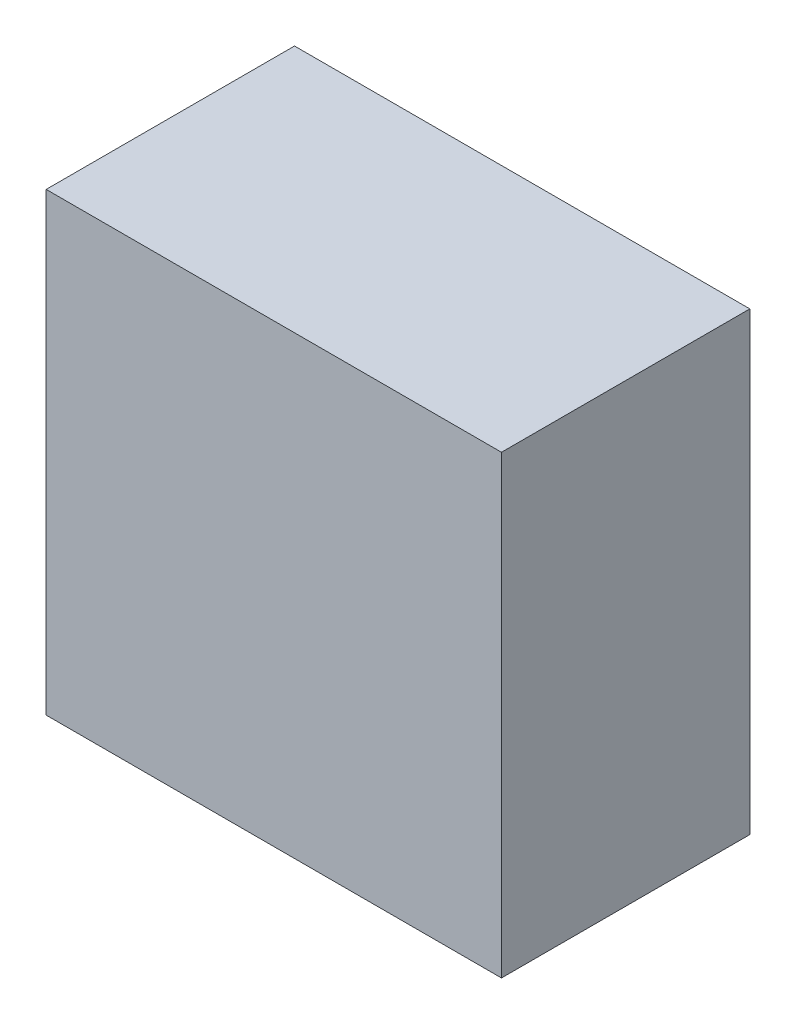
ISO-10303-21;
HEADER;
FILE_DESCRIPTION(('STEP AP214'),'2;1');
FILE_NAME('part.step','',(''),(''),'','','');
FILE_SCHEMA(('AUTOMOTIVE_DESIGN { 1 0 10303 214 1 1 1 1 }'));
ENDSEC;
DATA;
#1=APPLICATION_CONTEXT('core data for automotive mechanical design processes');
#2=APPLICATION_PROTOCOL_DEFINITION('international standard','automotive_design',2000,#1);
#3=PRODUCT_CONTEXT('',#1,'mechanical');
#4=PRODUCT('Part','Part','',(#3));
#5=PRODUCT_RELATED_PRODUCT_CATEGORY('part','',(#4));
#6=PRODUCT_DEFINITION_FORMATION('','',#4);
#7=PRODUCT_DEFINITION_CONTEXT('part definition',#1,'design');
#8=PRODUCT_DEFINITION('design','',#6,#7);
#9=PRODUCT_DEFINITION_SHAPE('','',#8);
#10=(LENGTH_UNIT() NAMED_UNIT(*) SI_UNIT(.MILLI.,.METRE.));
#11=(NAMED_UNIT(*) PLANE_ANGLE_UNIT() SI_UNIT($,.RADIAN.));
#12=(NAMED_UNIT(*) SI_UNIT($,.STERADIAN.) SOLID_ANGLE_UNIT());
#13=UNCERTAINTY_MEASURE_WITH_UNIT(LENGTH_MEASURE(1.E-05),#10,'distance_accuracy_value','');
#14=(GEOMETRIC_REPRESENTATION_CONTEXT(3) GLOBAL_UNCERTAINTY_ASSIGNED_CONTEXT((#13)) GLOBAL_UNIT_ASSIGNED_CONTEXT((#10,
#11,#12)) REPRESENTATION_CONTEXT('',''));
#15=CARTESIAN_POINT('',(0.,0.,0.));
#16=DIRECTION('',(0.,0.,1.));
#17=DIRECTION('',(1.,0.,0.));
#18=AXIS2_PLACEMENT_3D('',#15,#16,#17);
#19=CARTESIAN_POINT('',(11.,11.,12.));
#20=DIRECTION('',(-1.,0.,0.));
#21=DIRECTION('',(0.,-1.,0.));
#22=AXIS2_PLACEMENT_3D('',#19,#20,#21);
#23=PLANE('',#22);
#24=DIRECTION('',(0.,1.,0.));
#25=VECTOR('',#24,1.);
#26=CARTESIAN_POINT('',(11.,11.,0.));
#27=LINE('',#26,#25);
#28=CARTESIAN_POINT('',(11.,-11.,0.));
#29=VERTEX_POINT('',#28);
#30=CARTESIAN_POINT('',(11.,11.,0.));
#31=VERTEX_POINT('',#30);
#32=EDGE_CURVE('E95',#29,#31,#27,.T.);
#33=ORIENTED_EDGE('',*,*,#32,.T.);
#34=DIRECTION('',(0.,0.,-1.));
#35=VECTOR('',#34,1.);
#36=CARTESIAN_POINT('',(11.,11.,12.));
#37=LINE('',#36,#35);
#38=CARTESIAN_POINT('',(11.,11.,12.));
#39=VERTEX_POINT('',#38);
#40=EDGE_CURVE('E11',#39,#31,#37,.T.);
#41=ORIENTED_EDGE('',*,*,#40,.F.);
#42=DIRECTION('',(0.,1.,0.));
#43=VECTOR('',#42,1.);
#44=CARTESIAN_POINT('',(11.,11.,12.));
#45=LINE('',#44,#43);
#46=CARTESIAN_POINT('',(11.,-11.,12.));
#47=VERTEX_POINT('',#46);
#48=EDGE_CURVE('E83',#47,#39,#45,.T.);
#49=ORIENTED_EDGE('',*,*,#48,.F.);
#50=DIRECTION('',(0.,0.,-1.));
#51=VECTOR('',#50,1.);
#52=CARTESIAN_POINT('',(11.,-11.,12.));
#53=LINE('',#52,#51);
#54=EDGE_CURVE('E91',#47,#29,#53,.T.);
#55=ORIENTED_EDGE('',*,*,#54,.T.);
#56=EDGE_LOOP('',(#33,#41,#49,#55));
#57=FACE_BOUND('',#56,.T.);
#58=ADVANCED_FACE('F32',(#57),#23,.F.);
#59=CARTESIAN_POINT('',(-11.,11.,12.));
#60=DIRECTION('',(0.,-1.,0.));
#61=DIRECTION('',(0.,0.,-1.));
#62=AXIS2_PLACEMENT_3D('',#59,#60,#61);
#63=PLANE('',#62);
#64=DIRECTION('',(-1.,0.,0.));
#65=VECTOR('',#64,1.);
#66=CARTESIAN_POINT('',(-11.,11.,0.));
#67=LINE('',#66,#65);
#68=CARTESIAN_POINT('',(-11.,11.,0.));
#69=VERTEX_POINT('',#68);
#70=EDGE_CURVE('E87',#31,#69,#67,.T.);
#71=ORIENTED_EDGE('',*,*,#70,.T.);
#72=DIRECTION('',(0.,0.,-1.));
#73=VECTOR('',#72,1.);
#74=CARTESIAN_POINT('',(-11.,11.,12.));
#75=LINE('',#74,#73);
#76=CARTESIAN_POINT('',(-11.,11.,12.));
#77=VERTEX_POINT('',#76);
#78=EDGE_CURVE('E40',#77,#69,#75,.T.);
#79=ORIENTED_EDGE('',*,*,#78,.F.);
#80=DIRECTION('',(-1.,0.,0.));
#81=VECTOR('',#80,1.);
#82=CARTESIAN_POINT('',(-11.,11.,12.));
#83=LINE('',#82,#81);
#84=EDGE_CURVE('E78',#39,#77,#83,.T.);
#85=ORIENTED_EDGE('',*,*,#84,.F.);
#86=ORIENTED_EDGE('',*,*,#40,.T.);
#87=EDGE_LOOP('',(#71,#79,#85,#86));
#88=FACE_BOUND('',#87,.T.);
#89=ADVANCED_FACE('F86',(#88),#63,.F.);
#90=CARTESIAN_POINT('',(-11.,11.,12.));
#91=DIRECTION('',(1.,0.,0.));
#92=DIRECTION('',(0.,1.,0.));
#93=AXIS2_PLACEMENT_3D('',#90,#91,#92);
#94=PLANE('',#93);
#95=DIRECTION('',(0.,-1.,0.));
#96=VECTOR('',#95,1.);
#97=CARTESIAN_POINT('',(-11.,11.,0.));
#98=LINE('',#97,#96);
#99=CARTESIAN_POINT('',(-11.,-11.,0.));
#100=VERTEX_POINT('',#99);
#101=EDGE_CURVE('E65',#69,#100,#98,.T.);
#102=ORIENTED_EDGE('',*,*,#101,.T.);
#103=DIRECTION('',(0.,0.,-1.));
#104=VECTOR('',#103,1.);
#105=CARTESIAN_POINT('',(-11.,-11.,12.));
#106=LINE('',#105,#104);
#107=CARTESIAN_POINT('',(-11.,-11.,12.));
#108=VERTEX_POINT('',#107);
#109=EDGE_CURVE('E88',#108,#100,#106,.T.);
#110=ORIENTED_EDGE('',*,*,#109,.F.);
#111=DIRECTION('',(0.,-1.,0.));
#112=VECTOR('',#111,1.);
#113=CARTESIAN_POINT('',(-11.,11.,12.));
#114=LINE('',#113,#112);
#115=EDGE_CURVE('E81',#77,#108,#114,.T.);
#116=ORIENTED_EDGE('',*,*,#115,.F.);
#117=ORIENTED_EDGE('',*,*,#78,.T.);
#118=EDGE_LOOP('',(#102,#110,#116,#117));
#119=FACE_BOUND('',#118,.T.);
#120=ADVANCED_FACE('F89',(#119),#94,.F.);
#121=CARTESIAN_POINT('',(-11.,-11.,12.));
#122=DIRECTION('',(0.,1.,0.));
#123=DIRECTION('',(0.,0.,1.));
#124=AXIS2_PLACEMENT_3D('',#121,#122,#123);
#125=PLANE('',#124);
#126=DIRECTION('',(1.,0.,0.));
#127=VECTOR('',#126,1.);
#128=CARTESIAN_POINT('',(-11.,-11.,0.));
#129=LINE('',#128,#127);
#130=EDGE_CURVE('E71',#100,#29,#129,.T.);
#131=ORIENTED_EDGE('',*,*,#130,.T.);
#132=ORIENTED_EDGE('',*,*,#54,.F.);
#133=DIRECTION('',(1.,0.,0.));
#134=VECTOR('',#133,1.);
#135=CARTESIAN_POINT('',(-11.,-11.,12.));
#136=LINE('',#135,#134);
#137=EDGE_CURVE('E48',#108,#47,#136,.T.);
#138=ORIENTED_EDGE('',*,*,#137,.F.);
#139=ORIENTED_EDGE('',*,*,#109,.T.);
#140=EDGE_LOOP('',(#131,#132,#138,#139));
#141=FACE_BOUND('',#140,.T.);
#142=ADVANCED_FACE('F102',(#141),#125,.F.);
#143=CARTESIAN_POINT('',(0.,0.,12.));
#144=DIRECTION('',(0.,0.,1.));
#145=DIRECTION('',(1.,0.,0.));
#146=AXIS2_PLACEMENT_3D('',#143,#144,#145);
#147=PLANE('',#146);
#148=ORIENTED_EDGE('',*,*,#48,.T.);
#149=ORIENTED_EDGE('',*,*,#84,.T.);
#150=ORIENTED_EDGE('',*,*,#115,.T.);
#151=ORIENTED_EDGE('',*,*,#137,.T.);
#152=EDGE_LOOP('',(#148,#149,#150,#151));
#153=FACE_BOUND('',#152,.T.);
#154=ADVANCED_FACE('F79',(#153),#147,.T.);
#155=CARTESIAN_POINT('',(0.,0.,0.));
#156=DIRECTION('',(0.,0.,1.));
#157=DIRECTION('',(1.,0.,0.));
#158=AXIS2_PLACEMENT_3D('',#155,#156,#157);
#159=PLANE('',#158);
#160=ORIENTED_EDGE('',*,*,#32,.F.);
#161=ORIENTED_EDGE('',*,*,#130,.F.);
#162=ORIENTED_EDGE('',*,*,#101,.F.);
#163=ORIENTED_EDGE('',*,*,#70,.F.);
#164=EDGE_LOOP('',(#160,#161,#162,#163));
#165=FACE_BOUND('',#164,.T.);
#166=ADVANCED_FACE('F105',(#165),#159,.F.);
#167=CLOSED_SHELL('',(#58,#89,#120,#142,#154,#166));
#168=MANIFOLD_SOLID_BREP('B2',#167);
#169=ADVANCED_BREP_SHAPE_REPRESENTATION('',(#18,#168),#14);
#170=SHAPE_DEFINITION_REPRESENTATION(#9,#169);
ENDSEC;
END-ISO-10303-21;
